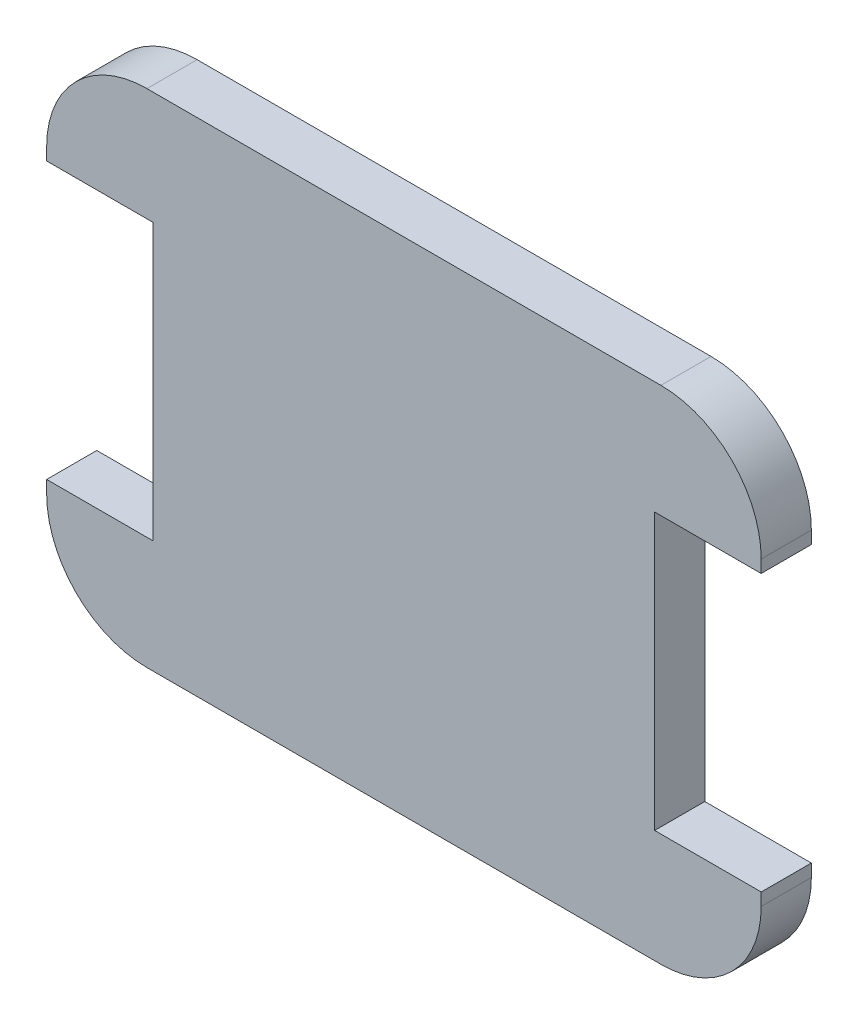
ISO-10303-21;
HEADER;
FILE_DESCRIPTION(('STEP AP214'),'2;1');
FILE_NAME('part.step','',(''),(''),'','','');
FILE_SCHEMA(('AUTOMOTIVE_DESIGN { 1 0 10303 214 1 1 1 1 }'));
ENDSEC;
DATA;
#1=APPLICATION_CONTEXT('core data for automotive mechanical design processes');
#2=APPLICATION_PROTOCOL_DEFINITION('international standard','automotive_design',2000,#1);
#3=PRODUCT_CONTEXT('',#1,'mechanical');
#4=PRODUCT('Part','Part','',(#3));
#5=PRODUCT_RELATED_PRODUCT_CATEGORY('part','',(#4));
#6=PRODUCT_DEFINITION_FORMATION('','',#4);
#7=PRODUCT_DEFINITION_CONTEXT('part definition',#1,'design');
#8=PRODUCT_DEFINITION('design','',#6,#7);
#9=PRODUCT_DEFINITION_SHAPE('','',#8);
#10=(LENGTH_UNIT() NAMED_UNIT(*) SI_UNIT(.MILLI.,.METRE.));
#11=(NAMED_UNIT(*) PLANE_ANGLE_UNIT() SI_UNIT($,.RADIAN.));
#12=(NAMED_UNIT(*) SI_UNIT($,.STERADIAN.) SOLID_ANGLE_UNIT());
#13=UNCERTAINTY_MEASURE_WITH_UNIT(LENGTH_MEASURE(1.E-05),#10,'distance_accuracy_value','');
#14=(GEOMETRIC_REPRESENTATION_CONTEXT(3) GLOBAL_UNCERTAINTY_ASSIGNED_CONTEXT((#13)) GLOBAL_UNIT_ASSIGNED_CONTEXT((#10,
#11,#12)) REPRESENTATION_CONTEXT('',''));
#15=CARTESIAN_POINT('',(0.,0.,0.));
#16=DIRECTION('',(0.,0.,1.));
#17=DIRECTION('',(1.,0.,0.));
#18=AXIS2_PLACEMENT_3D('',#15,#16,#17);
#19=CARTESIAN_POINT('',(-5.,-5.,1.));
#20=DIRECTION('',(1.,0.,0.));
#21=DIRECTION('',(0.,0.,-1.));
#22=AXIS2_PLACEMENT_3D('',#19,#20,#21);
#23=PLANE('',#22);
#24=DIRECTION('',(0.,-1.,0.));
#25=VECTOR('',#24,1.);
#26=CARTESIAN_POINT('',(-5.,-5.,0.));
#27=LINE('',#26,#25);
#28=CARTESIAN_POINT('',(-5.,2.75,0.));
#29=VERTEX_POINT('',#28);
#30=CARTESIAN_POINT('',(-5.,-2.75,0.));
#31=VERTEX_POINT('',#30);
#32=EDGE_CURVE('E70',#29,#31,#27,.T.);
#33=ORIENTED_EDGE('',*,*,#32,.T.);
#34=DIRECTION('',(0.,0.,1.));
#35=VECTOR('',#34,1.);
#36=CARTESIAN_POINT('',(-5.,-2.75,0.));
#37=LINE('',#36,#35);
#38=CARTESIAN_POINT('',(-5.,-2.75,1.));
#39=VERTEX_POINT('',#38);
#40=EDGE_CURVE('E65',#31,#39,#37,.T.);
#41=ORIENTED_EDGE('',*,*,#40,.T.);
#42=DIRECTION('',(0.,-1.,0.));
#43=VECTOR('',#42,1.);
#44=CARTESIAN_POINT('',(-5.,-5.,1.));
#45=LINE('',#44,#43);
#46=CARTESIAN_POINT('',(-5.,2.75,1.));
#47=VERTEX_POINT('',#46);
#48=EDGE_CURVE('E57',#47,#39,#45,.T.);
#49=ORIENTED_EDGE('',*,*,#48,.F.);
#50=DIRECTION('',(0.,0.,1.));
#51=VECTOR('',#50,1.);
#52=CARTESIAN_POINT('',(-5.,2.75,0.));
#53=LINE('',#52,#51);
#54=EDGE_CURVE('E302',#29,#47,#53,.T.);
#55=ORIENTED_EDGE('',*,*,#54,.F.);
#56=EDGE_LOOP('',(#33,#41,#49,#55));
#57=FACE_BOUND('',#56,.T.);
#58=ADVANCED_FACE('F47',(#57),#23,.F.);
#59=CARTESIAN_POINT('',(5.,-5.,1.));
#60=DIRECTION('',(-1.,0.,0.));
#61=DIRECTION('',(0.,0.,1.));
#62=AXIS2_PLACEMENT_3D('',#59,#60,#61);
#63=PLANE('',#62);
#64=DIRECTION('',(0.,1.,0.));
#65=VECTOR('',#64,1.);
#66=CARTESIAN_POINT('',(5.,-5.,1.));
#67=LINE('',#66,#65);
#68=CARTESIAN_POINT('',(5.,-2.75,1.));
#69=VERTEX_POINT('',#68);
#70=CARTESIAN_POINT('',(5.,2.75,1.));
#71=VERTEX_POINT('',#70);
#72=EDGE_CURVE('E316',#69,#71,#67,.T.);
#73=ORIENTED_EDGE('',*,*,#72,.F.);
#74=DIRECTION('',(0.,0.,1.));
#75=VECTOR('',#74,1.);
#76=CARTESIAN_POINT('',(5.,-2.75,0.));
#77=LINE('',#76,#75);
#78=CARTESIAN_POINT('',(5.,-2.75,0.));
#79=VERTEX_POINT('',#78);
#80=EDGE_CURVE('E209',#79,#69,#77,.T.);
#81=ORIENTED_EDGE('',*,*,#80,.F.);
#82=DIRECTION('',(0.,1.,0.));
#83=VECTOR('',#82,1.);
#84=CARTESIAN_POINT('',(5.,-5.,0.));
#85=LINE('',#84,#83);
#86=CARTESIAN_POINT('',(5.,2.75,0.));
#87=VERTEX_POINT('',#86);
#88=EDGE_CURVE('E306',#79,#87,#85,.T.);
#89=ORIENTED_EDGE('',*,*,#88,.T.);
#90=DIRECTION('',(0.,0.,1.));
#91=VECTOR('',#90,1.);
#92=CARTESIAN_POINT('',(5.,2.75,0.));
#93=LINE('',#92,#91);
#94=EDGE_CURVE('E245',#87,#71,#93,.T.);
#95=ORIENTED_EDGE('',*,*,#94,.T.);
#96=EDGE_LOOP('',(#73,#81,#89,#95));
#97=FACE_BOUND('',#96,.T.);
#98=ADVANCED_FACE('F49',(#97),#63,.F.);
#99=CARTESIAN_POINT('',(-5.,5.,1.));
#100=DIRECTION('',(0.,-1.,0.));
#101=DIRECTION('',(0.,0.,-1.));
#102=AXIS2_PLACEMENT_3D('',#99,#100,#101);
#103=PLANE('',#102);
#104=DIRECTION('',(-1.,0.,0.));
#105=VECTOR('',#104,1.);
#106=CARTESIAN_POINT('',(-5.,5.,0.));
#107=LINE('',#106,#105);
#108=CARTESIAN_POINT('',(5.12499999999999,5.,0.));
#109=VERTEX_POINT('',#108);
#110=CARTESIAN_POINT('',(-5.12499999999999,5.,0.));
#111=VERTEX_POINT('',#110);
#112=EDGE_CURVE('E326',#109,#111,#107,.T.);
#113=ORIENTED_EDGE('',*,*,#112,.T.);
#114=DIRECTION('',(0.,0.,1.));
#115=VECTOR('',#114,1.);
#116=CARTESIAN_POINT('',(-5.12499999999999,5.,0.));
#117=LINE('',#116,#115);
#118=CARTESIAN_POINT('',(-5.12499999999999,5.,1.));
#119=VERTEX_POINT('',#118);
#120=EDGE_CURVE('E291',#111,#119,#117,.T.);
#121=ORIENTED_EDGE('',*,*,#120,.T.);
#122=DIRECTION('',(-1.,0.,0.));
#123=VECTOR('',#122,1.);
#124=CARTESIAN_POINT('',(-5.,5.,1.));
#125=LINE('',#124,#123);
#126=CARTESIAN_POINT('',(5.12499999999999,5.,1.));
#127=VERTEX_POINT('',#126);
#128=EDGE_CURVE('E319',#127,#119,#125,.T.);
#129=ORIENTED_EDGE('',*,*,#128,.F.);
#130=DIRECTION('',(0.,0.,1.));
#131=VECTOR('',#130,1.);
#132=CARTESIAN_POINT('',(5.12499999999999,5.,0.));
#133=LINE('',#132,#131);
#134=EDGE_CURVE('E240',#109,#127,#133,.T.);
#135=ORIENTED_EDGE('',*,*,#134,.F.);
#136=EDGE_LOOP('',(#113,#121,#129,#135));
#137=FACE_BOUND('',#136,.T.);
#138=ADVANCED_FACE('F364',(#137),#103,.F.);
#139=CARTESIAN_POINT('',(-5.,-5.,1.));
#140=DIRECTION('',(0.,1.,0.));
#141=DIRECTION('',(0.,0.,1.));
#142=AXIS2_PLACEMENT_3D('',#139,#140,#141);
#143=PLANE('',#142);
#144=DIRECTION('',(1.,0.,0.));
#145=VECTOR('',#144,1.);
#146=CARTESIAN_POINT('',(-5.,-5.,0.));
#147=LINE('',#146,#145);
#148=CARTESIAN_POINT('',(-5.12499999999999,-5.,0.));
#149=VERTEX_POINT('',#148);
#150=CARTESIAN_POINT('',(5.12499999999999,-5.,0.));
#151=VERTEX_POINT('',#150);
#152=EDGE_CURVE('E51',#149,#151,#147,.T.);
#153=ORIENTED_EDGE('',*,*,#152,.T.);
#154=DIRECTION('',(0.,0.,1.));
#155=VECTOR('',#154,1.);
#156=CARTESIAN_POINT('',(5.12499999999999,-5.,0.));
#157=LINE('',#156,#155);
#158=CARTESIAN_POINT('',(5.12499999999999,-5.,1.));
#159=VERTEX_POINT('',#158);
#160=EDGE_CURVE('E181',#151,#159,#157,.T.);
#161=ORIENTED_EDGE('',*,*,#160,.T.);
#162=DIRECTION('',(1.,0.,0.));
#163=VECTOR('',#162,1.);
#164=CARTESIAN_POINT('',(-5.,-5.,1.));
#165=LINE('',#164,#163);
#166=CARTESIAN_POINT('',(-5.12499999999999,-5.,1.));
#167=VERTEX_POINT('',#166);
#168=EDGE_CURVE('E11',#167,#159,#165,.T.);
#169=ORIENTED_EDGE('',*,*,#168,.F.);
#170=DIRECTION('',(0.,0.,1.));
#171=VECTOR('',#170,1.);
#172=CARTESIAN_POINT('',(-5.12499999999999,-5.,0.));
#173=LINE('',#172,#171);
#174=EDGE_CURVE('E178',#149,#167,#173,.T.);
#175=ORIENTED_EDGE('',*,*,#174,.F.);
#176=EDGE_LOOP('',(#153,#161,#169,#175));
#177=FACE_BOUND('',#176,.T.);
#178=ADVANCED_FACE('F332',(#177),#143,.F.);
#179=CARTESIAN_POINT('',(0.,0.,1.));
#180=DIRECTION('',(0.,0.,-1.));
#181=DIRECTION('',(-1.,0.,0.));
#182=AXIS2_PLACEMENT_3D('',#179,#180,#181);
#183=PLANE('',#182);
#184=ORIENTED_EDGE('',*,*,#168,.T.);
#185=CARTESIAN_POINT('',(5.125,-3.,1.));
#186=DIRECTION('',(0.,0.,1.));
#187=DIRECTION('',(1.,0.,0.));
#188=AXIS2_PLACEMENT_3D('',#185,#186,#187);
#189=CIRCLE('',#188,2.);
#190=CARTESIAN_POINT('',(7.125,-2.99999999999999,1.));
#191=VERTEX_POINT('',#190);
#192=EDGE_CURVE('E225',#159,#191,#189,.T.);
#193=ORIENTED_EDGE('',*,*,#192,.T.);
#194=DIRECTION('',(0.,1.,0.));
#195=VECTOR('',#194,1.);
#196=CARTESIAN_POINT('',(7.125,-2.99999999999999,1.));
#197=LINE('',#196,#195);
#198=CARTESIAN_POINT('',(7.125,-2.75,1.));
#199=VERTEX_POINT('',#198);
#200=EDGE_CURVE('E220',#191,#199,#197,.T.);
#201=ORIENTED_EDGE('',*,*,#200,.T.);
#202=DIRECTION('',(-1.,0.,0.));
#203=VECTOR('',#202,1.);
#204=CARTESIAN_POINT('',(5.,-2.75,1.));
#205=LINE('',#204,#203);
#206=EDGE_CURVE('E216',#199,#69,#205,.T.);
#207=ORIENTED_EDGE('',*,*,#206,.T.);
#208=ORIENTED_EDGE('',*,*,#72,.T.);
#209=DIRECTION('',(1.,0.,0.));
#210=VECTOR('',#209,1.);
#211=CARTESIAN_POINT('',(5.,2.75,1.));
#212=LINE('',#211,#210);
#213=CARTESIAN_POINT('',(7.125,2.75,1.));
#214=VERTEX_POINT('',#213);
#215=EDGE_CURVE('E258',#71,#214,#212,.T.);
#216=ORIENTED_EDGE('',*,*,#215,.T.);
#217=DIRECTION('',(0.,1.,0.));
#218=VECTOR('',#217,1.);
#219=CARTESIAN_POINT('',(7.125,2.99999999999999,1.));
#220=LINE('',#219,#218);
#221=CARTESIAN_POINT('',(7.125,2.99999999999999,1.));
#222=VERTEX_POINT('',#221);
#223=EDGE_CURVE('E254',#214,#222,#220,.T.);
#224=ORIENTED_EDGE('',*,*,#223,.T.);
#225=CARTESIAN_POINT('',(5.125,3.,1.));
#226=DIRECTION('',(0.,0.,1.));
#227=DIRECTION('',(-1.,0.,0.));
#228=AXIS2_PLACEMENT_3D('',#225,#226,#227);
#229=CIRCLE('',#228,2.);
#230=EDGE_CURVE('E263',#222,#127,#229,.T.);
#231=ORIENTED_EDGE('',*,*,#230,.T.);
#232=ORIENTED_EDGE('',*,*,#128,.T.);
#233=CARTESIAN_POINT('',(-5.125,3.,1.));
#234=DIRECTION('',(0.,0.,1.));
#235=DIRECTION('',(1.,0.,0.));
#236=AXIS2_PLACEMENT_3D('',#233,#234,#235);
#237=CIRCLE('',#236,2.);
#238=CARTESIAN_POINT('',(-7.125,2.99999999999999,1.));
#239=VERTEX_POINT('',#238);
#240=EDGE_CURVE('E267',#119,#239,#237,.T.);
#241=ORIENTED_EDGE('',*,*,#240,.T.);
#242=DIRECTION('',(0.,-1.,0.));
#243=VECTOR('',#242,1.);
#244=CARTESIAN_POINT('',(-7.125,2.99999999999999,1.));
#245=LINE('',#244,#243);
#246=CARTESIAN_POINT('',(-7.125,2.75,1.));
#247=VERTEX_POINT('',#246);
#248=EDGE_CURVE('E295',#239,#247,#245,.T.);
#249=ORIENTED_EDGE('',*,*,#248,.T.);
#250=DIRECTION('',(1.,0.,0.));
#251=VECTOR('',#250,1.);
#252=CARTESIAN_POINT('',(-5.,2.75,1.));
#253=LINE('',#252,#251);
#254=EDGE_CURVE('E283',#247,#47,#253,.T.);
#255=ORIENTED_EDGE('',*,*,#254,.T.);
#256=ORIENTED_EDGE('',*,*,#48,.T.);
#257=DIRECTION('',(-1.,0.,0.));
#258=VECTOR('',#257,1.);
#259=CARTESIAN_POINT('',(-5.,-2.75,1.));
#260=LINE('',#259,#258);
#261=CARTESIAN_POINT('',(-7.125,-2.75,1.));
#262=VERTEX_POINT('',#261);
#263=EDGE_CURVE('E182',#39,#262,#260,.T.);
#264=ORIENTED_EDGE('',*,*,#263,.T.);
#265=DIRECTION('',(0.,-1.,0.));
#266=VECTOR('',#265,1.);
#267=CARTESIAN_POINT('',(-7.125,-2.99999999999999,1.));
#268=LINE('',#267,#266);
#269=CARTESIAN_POINT('',(-7.125,-2.99999999999999,1.));
#270=VERTEX_POINT('',#269);
#271=EDGE_CURVE('E164',#262,#270,#268,.T.);
#272=ORIENTED_EDGE('',*,*,#271,.T.);
#273=CARTESIAN_POINT('',(-5.125,-3.,1.));
#274=DIRECTION('',(0.,0.,1.));
#275=DIRECTION('',(-1.,0.,0.));
#276=AXIS2_PLACEMENT_3D('',#273,#274,#275);
#277=CIRCLE('',#276,2.);
#278=EDGE_CURVE('E175',#270,#167,#277,.T.);
#279=ORIENTED_EDGE('',*,*,#278,.T.);
#280=EDGE_LOOP('',(#184,#193,#201,#207,#208,#216,#224,#231,#232,#241,#249,#255,#256,#264,#272,#279));
#281=FACE_BOUND('',#280,.T.);
#282=ADVANCED_FACE('F185',(#281),#183,.F.);
#283=CARTESIAN_POINT('',(0.,0.,0.));
#284=DIRECTION('',(0.,0.,-1.));
#285=DIRECTION('',(-1.,0.,0.));
#286=AXIS2_PLACEMENT_3D('',#283,#284,#285);
#287=PLANE('',#286);
#288=ORIENTED_EDGE('',*,*,#88,.F.);
#289=DIRECTION('',(-1.,0.,0.));
#290=VECTOR('',#289,1.);
#291=CARTESIAN_POINT('',(5.,-2.75,0.));
#292=LINE('',#291,#290);
#293=CARTESIAN_POINT('',(7.125,-2.75,0.));
#294=VERTEX_POINT('',#293);
#295=EDGE_CURVE('E205',#294,#79,#292,.T.);
#296=ORIENTED_EDGE('',*,*,#295,.F.);
#297=DIRECTION('',(0.,1.,0.));
#298=VECTOR('',#297,1.);
#299=CARTESIAN_POINT('',(7.125,-2.99999999999999,0.));
#300=LINE('',#299,#298);
#301=CARTESIAN_POINT('',(7.125,-2.99999999999999,0.));
#302=VERTEX_POINT('',#301);
#303=EDGE_CURVE('E233',#302,#294,#300,.T.);
#304=ORIENTED_EDGE('',*,*,#303,.F.);
#305=CARTESIAN_POINT('',(5.125,-3.,0.));
#306=DIRECTION('',(0.,0.,1.));
#307=DIRECTION('',(1.,0.,0.));
#308=AXIS2_PLACEMENT_3D('',#305,#306,#307);
#309=CIRCLE('',#308,2.);
#310=EDGE_CURVE('E221',#151,#302,#309,.T.);
#311=ORIENTED_EDGE('',*,*,#310,.F.);
#312=ORIENTED_EDGE('',*,*,#152,.F.);
#313=CARTESIAN_POINT('',(-5.125,-3.,0.));
#314=DIRECTION('',(0.,0.,1.));
#315=DIRECTION('',(-1.,0.,0.));
#316=AXIS2_PLACEMENT_3D('',#313,#314,#315);
#317=CIRCLE('',#316,2.);
#318=CARTESIAN_POINT('',(-7.125,-2.99999999999999,0.));
#319=VERTEX_POINT('',#318);
#320=EDGE_CURVE('E188',#319,#149,#317,.T.);
#321=ORIENTED_EDGE('',*,*,#320,.F.);
#322=DIRECTION('',(0.,-1.,0.));
#323=VECTOR('',#322,1.);
#324=CARTESIAN_POINT('',(-7.125,-2.99999999999999,0.));
#325=LINE('',#324,#323);
#326=CARTESIAN_POINT('',(-7.125,-2.75,0.));
#327=VERTEX_POINT('',#326);
#328=EDGE_CURVE('E166',#327,#319,#325,.T.);
#329=ORIENTED_EDGE('',*,*,#328,.F.);
#330=DIRECTION('',(-1.,0.,0.));
#331=VECTOR('',#330,1.);
#332=CARTESIAN_POINT('',(-5.,-2.75,0.));
#333=LINE('',#332,#331);
#334=EDGE_CURVE('E193',#31,#327,#333,.T.);
#335=ORIENTED_EDGE('',*,*,#334,.F.);
#336=ORIENTED_EDGE('',*,*,#32,.F.);
#337=DIRECTION('',(1.,0.,0.));
#338=VECTOR('',#337,1.);
#339=CARTESIAN_POINT('',(-5.,2.75,0.));
#340=LINE('',#339,#338);
#341=CARTESIAN_POINT('',(-7.125,2.75,0.));
#342=VERTEX_POINT('',#341);
#343=EDGE_CURVE('E287',#342,#29,#340,.T.);
#344=ORIENTED_EDGE('',*,*,#343,.F.);
#345=DIRECTION('',(0.,-1.,0.));
#346=VECTOR('',#345,1.);
#347=CARTESIAN_POINT('',(-7.125,2.99999999999999,0.));
#348=LINE('',#347,#346);
#349=CARTESIAN_POINT('',(-7.125,2.99999999999999,0.));
#350=VERTEX_POINT('',#349);
#351=EDGE_CURVE('E282',#350,#342,#348,.T.);
#352=ORIENTED_EDGE('',*,*,#351,.F.);
#353=CARTESIAN_POINT('',(-5.125,3.,0.));
#354=DIRECTION('',(0.,0.,1.));
#355=DIRECTION('',(1.,0.,0.));
#356=AXIS2_PLACEMENT_3D('',#353,#354,#355);
#357=CIRCLE('',#356,2.);
#358=EDGE_CURVE('E278',#111,#350,#357,.T.);
#359=ORIENTED_EDGE('',*,*,#358,.F.);
#360=ORIENTED_EDGE('',*,*,#112,.F.);
#361=CARTESIAN_POINT('',(5.125,3.,0.));
#362=DIRECTION('',(0.,0.,1.));
#363=DIRECTION('',(-1.,0.,0.));
#364=AXIS2_PLACEMENT_3D('',#361,#362,#363);
#365=CIRCLE('',#364,2.);
#366=CARTESIAN_POINT('',(7.125,2.99999999999999,0.));
#367=VERTEX_POINT('',#366);
#368=EDGE_CURVE('E259',#367,#109,#365,.T.);
#369=ORIENTED_EDGE('',*,*,#368,.F.);
#370=DIRECTION('',(0.,1.,0.));
#371=VECTOR('',#370,1.);
#372=CARTESIAN_POINT('',(7.125,2.99999999999999,0.));
#373=LINE('',#372,#371);
#374=CARTESIAN_POINT('',(7.125,2.75,0.));
#375=VERTEX_POINT('',#374);
#376=EDGE_CURVE('E244',#375,#367,#373,.T.);
#377=ORIENTED_EDGE('',*,*,#376,.F.);
#378=DIRECTION('',(1.,0.,0.));
#379=VECTOR('',#378,1.);
#380=CARTESIAN_POINT('',(5.,2.75,0.));
#381=LINE('',#380,#379);
#382=EDGE_CURVE('E271',#87,#375,#381,.T.);
#383=ORIENTED_EDGE('',*,*,#382,.F.);
#384=EDGE_LOOP('',(#288,#296,#304,#311,#312,#321,#329,#335,#336,#344,#352,#359,#360,#369,#377,#383));
#385=FACE_BOUND('',#384,.T.);
#386=ADVANCED_FACE('F339',(#385),#287,.T.);
#387=CARTESIAN_POINT('',(-5.,2.75,0.));
#388=DIRECTION('',(0.,-1.,0.));
#389=DIRECTION('',(1.,0.,0.));
#390=AXIS2_PLACEMENT_3D('',#387,#388,#389);
#391=PLANE('',#390);
#392=ORIENTED_EDGE('',*,*,#254,.F.);
#393=DIRECTION('',(0.,0.,1.));
#394=VECTOR('',#393,1.);
#395=CARTESIAN_POINT('',(-7.125,2.75,0.));
#396=LINE('',#395,#394);
#397=EDGE_CURVE('E307',#342,#247,#396,.T.);
#398=ORIENTED_EDGE('',*,*,#397,.F.);
#399=ORIENTED_EDGE('',*,*,#343,.T.);
#400=ORIENTED_EDGE('',*,*,#54,.T.);
#401=EDGE_LOOP('',(#392,#398,#399,#400));
#402=FACE_BOUND('',#401,.T.);
#403=ADVANCED_FACE('F374',(#402),#391,.T.);
#404=CARTESIAN_POINT('',(-7.125,2.99999999999999,0.));
#405=DIRECTION('',(-1.,0.,0.));
#406=DIRECTION('',(0.,0.,1.));
#407=AXIS2_PLACEMENT_3D('',#404,#405,#406);
#408=PLANE('',#407);
#409=ORIENTED_EDGE('',*,*,#248,.F.);
#410=DIRECTION('',(0.,0.,1.));
#411=VECTOR('',#410,1.);
#412=CARTESIAN_POINT('',(-7.125,2.99999999999999,0.));
#413=LINE('',#412,#411);
#414=EDGE_CURVE('E310',#350,#239,#413,.T.);
#415=ORIENTED_EDGE('',*,*,#414,.F.);
#416=ORIENTED_EDGE('',*,*,#351,.T.);
#417=ORIENTED_EDGE('',*,*,#397,.T.);
#418=EDGE_LOOP('',(#409,#415,#416,#417));
#419=FACE_BOUND('',#418,.T.);
#420=ADVANCED_FACE('F413',(#419),#408,.T.);
#421=CARTESIAN_POINT('',(-5.125,3.,0.));
#422=DIRECTION('',(0.,0.,1.));
#423=DIRECTION('',(1.,0.,0.));
#424=AXIS2_PLACEMENT_3D('',#421,#422,#423);
#425=CYLINDRICAL_SURFACE('',#424,2.);
#426=ORIENTED_EDGE('',*,*,#240,.F.);
#427=ORIENTED_EDGE('',*,*,#120,.F.);
#428=ORIENTED_EDGE('',*,*,#358,.T.);
#429=ORIENTED_EDGE('',*,*,#414,.T.);
#430=EDGE_LOOP('',(#426,#427,#428,#429));
#431=FACE_BOUND('',#430,.T.);
#432=ADVANCED_FACE('F369',(#431),#425,.T.);
#433=CARTESIAN_POINT('',(5.125,3.,0.));
#434=DIRECTION('',(0.,0.,1.));
#435=DIRECTION('',(1.,0.,0.));
#436=AXIS2_PLACEMENT_3D('',#433,#434,#435);
#437=CYLINDRICAL_SURFACE('',#436,2.);
#438=ORIENTED_EDGE('',*,*,#230,.F.);
#439=DIRECTION('',(0.,0.,1.));
#440=VECTOR('',#439,1.);
#441=CARTESIAN_POINT('',(7.125,2.99999999999999,0.));
#442=LINE('',#441,#440);
#443=EDGE_CURVE('E229',#367,#222,#442,.T.);
#444=ORIENTED_EDGE('',*,*,#443,.F.);
#445=ORIENTED_EDGE('',*,*,#368,.T.);
#446=ORIENTED_EDGE('',*,*,#134,.T.);
#447=EDGE_LOOP('',(#438,#444,#445,#446));
#448=FACE_BOUND('',#447,.T.);
#449=ADVANCED_FACE('F361',(#448),#437,.T.);
#450=CARTESIAN_POINT('',(7.125,2.99999999999999,0.));
#451=DIRECTION('',(1.,0.,0.));
#452=DIRECTION('',(0.,0.,-1.));
#453=AXIS2_PLACEMENT_3D('',#450,#451,#452);
#454=PLANE('',#453);
#455=ORIENTED_EDGE('',*,*,#223,.F.);
#456=DIRECTION('',(0.,0.,1.));
#457=VECTOR('',#456,1.);
#458=CARTESIAN_POINT('',(7.125,2.75,0.));
#459=LINE('',#458,#457);
#460=EDGE_CURVE('E249',#375,#214,#459,.T.);
#461=ORIENTED_EDGE('',*,*,#460,.F.);
#462=ORIENTED_EDGE('',*,*,#376,.T.);
#463=ORIENTED_EDGE('',*,*,#443,.T.);
#464=EDGE_LOOP('',(#455,#461,#462,#463));
#465=FACE_BOUND('',#464,.T.);
#466=ADVANCED_FACE('F358',(#465),#454,.T.);
#467=CARTESIAN_POINT('',(5.,2.75,0.));
#468=DIRECTION('',(0.,-1.,0.));
#469=DIRECTION('',(1.,0.,0.));
#470=AXIS2_PLACEMENT_3D('',#467,#468,#469);
#471=PLANE('',#470);
#472=ORIENTED_EDGE('',*,*,#215,.F.);
#473=ORIENTED_EDGE('',*,*,#94,.F.);
#474=ORIENTED_EDGE('',*,*,#382,.T.);
#475=ORIENTED_EDGE('',*,*,#460,.T.);
#476=EDGE_LOOP('',(#472,#473,#474,#475));
#477=FACE_BOUND('',#476,.T.);
#478=ADVANCED_FACE('F353',(#477),#471,.T.);
#479=CARTESIAN_POINT('',(5.125,-3.,0.));
#480=DIRECTION('',(0.,0.,1.));
#481=DIRECTION('',(1.,0.,0.));
#482=AXIS2_PLACEMENT_3D('',#479,#480,#481);
#483=CYLINDRICAL_SURFACE('',#482,2.);
#484=ORIENTED_EDGE('',*,*,#192,.F.);
#485=ORIENTED_EDGE('',*,*,#160,.F.);
#486=ORIENTED_EDGE('',*,*,#310,.T.);
#487=DIRECTION('',(0.,0.,1.));
#488=VECTOR('',#487,1.);
#489=CARTESIAN_POINT('',(7.125,-2.99999999999999,0.));
#490=LINE('',#489,#488);
#491=EDGE_CURVE('E202',#302,#191,#490,.T.);
#492=ORIENTED_EDGE('',*,*,#491,.T.);
#493=EDGE_LOOP('',(#484,#485,#486,#492));
#494=FACE_BOUND('',#493,.T.);
#495=ADVANCED_FACE('F337',(#494),#483,.T.);
#496=CARTESIAN_POINT('',(5.,-2.75,0.));
#497=DIRECTION('',(0.,1.,0.));
#498=DIRECTION('',(-1.,0.,0.));
#499=AXIS2_PLACEMENT_3D('',#496,#497,#498);
#500=PLANE('',#499);
#501=ORIENTED_EDGE('',*,*,#206,.F.);
#502=DIRECTION('',(0.,0.,1.));
#503=VECTOR('',#502,1.);
#504=CARTESIAN_POINT('',(7.125,-2.75,0.));
#505=LINE('',#504,#503);
#506=EDGE_CURVE('E206',#294,#199,#505,.T.);
#507=ORIENTED_EDGE('',*,*,#506,.F.);
#508=ORIENTED_EDGE('',*,*,#295,.T.);
#509=ORIENTED_EDGE('',*,*,#80,.T.);
#510=EDGE_LOOP('',(#501,#507,#508,#509));
#511=FACE_BOUND('',#510,.T.);
#512=ADVANCED_FACE('F347',(#511),#500,.T.);
#513=CARTESIAN_POINT('',(7.125,-2.99999999999999,0.));
#514=DIRECTION('',(1.,0.,0.));
#515=DIRECTION('',(0.,0.,-1.));
#516=AXIS2_PLACEMENT_3D('',#513,#514,#515);
#517=PLANE('',#516);
#518=ORIENTED_EDGE('',*,*,#200,.F.);
#519=ORIENTED_EDGE('',*,*,#491,.F.);
#520=ORIENTED_EDGE('',*,*,#303,.T.);
#521=ORIENTED_EDGE('',*,*,#506,.T.);
#522=EDGE_LOOP('',(#518,#519,#520,#521));
#523=FACE_BOUND('',#522,.T.);
#524=ADVANCED_FACE('F343',(#523),#517,.T.);
#525=CARTESIAN_POINT('',(-5.125,-3.,0.));
#526=DIRECTION('',(0.,0.,1.));
#527=DIRECTION('',(1.,0.,0.));
#528=AXIS2_PLACEMENT_3D('',#525,#526,#527);
#529=CYLINDRICAL_SURFACE('',#528,2.);
#530=ORIENTED_EDGE('',*,*,#278,.F.);
#531=DIRECTION('',(0.,0.,1.));
#532=VECTOR('',#531,1.);
#533=CARTESIAN_POINT('',(-7.125,-2.99999999999999,0.));
#534=LINE('',#533,#532);
#535=EDGE_CURVE('E160',#319,#270,#534,.T.);
#536=ORIENTED_EDGE('',*,*,#535,.F.);
#537=ORIENTED_EDGE('',*,*,#320,.T.);
#538=ORIENTED_EDGE('',*,*,#174,.T.);
#539=EDGE_LOOP('',(#530,#536,#537,#538));
#540=FACE_BOUND('',#539,.T.);
#541=ADVANCED_FACE('F176',(#540),#529,.T.);
#542=CARTESIAN_POINT('',(-7.125,-2.99999999999999,0.));
#543=DIRECTION('',(-1.,0.,0.));
#544=DIRECTION('',(0.,0.,1.));
#545=AXIS2_PLACEMENT_3D('',#542,#543,#544);
#546=PLANE('',#545);
#547=ORIENTED_EDGE('',*,*,#271,.F.);
#548=DIRECTION('',(0.,0.,1.));
#549=VECTOR('',#548,1.);
#550=CARTESIAN_POINT('',(-7.125,-2.75,0.));
#551=LINE('',#550,#549);
#552=EDGE_CURVE('E171',#327,#262,#551,.T.);
#553=ORIENTED_EDGE('',*,*,#552,.F.);
#554=ORIENTED_EDGE('',*,*,#328,.T.);
#555=ORIENTED_EDGE('',*,*,#535,.T.);
#556=EDGE_LOOP('',(#547,#553,#554,#555));
#557=FACE_BOUND('',#556,.T.);
#558=ADVANCED_FACE('F162',(#557),#546,.T.);
#559=CARTESIAN_POINT('',(-5.,-2.75,0.));
#560=DIRECTION('',(0.,1.,0.));
#561=DIRECTION('',(-1.,0.,0.));
#562=AXIS2_PLACEMENT_3D('',#559,#560,#561);
#563=PLANE('',#562);
#564=ORIENTED_EDGE('',*,*,#263,.F.);
#565=ORIENTED_EDGE('',*,*,#40,.F.);
#566=ORIENTED_EDGE('',*,*,#334,.T.);
#567=ORIENTED_EDGE('',*,*,#552,.T.);
#568=EDGE_LOOP('',(#564,#565,#566,#567));
#569=FACE_BOUND('',#568,.T.);
#570=ADVANCED_FACE('F379',(#569),#563,.T.);
#571=CLOSED_SHELL('',(#58,#98,#138,#178,#282,#386,#403,#420,#432,#449,#466,#478,#495,#512,#524,
#541,#558,#570));
#572=MANIFOLD_SOLID_BREP('B2',#571);
#573=ADVANCED_BREP_SHAPE_REPRESENTATION('',(#18,#572),#14);
#574=SHAPE_DEFINITION_REPRESENTATION(#9,#573);
ENDSEC;
END-ISO-10303-21;
